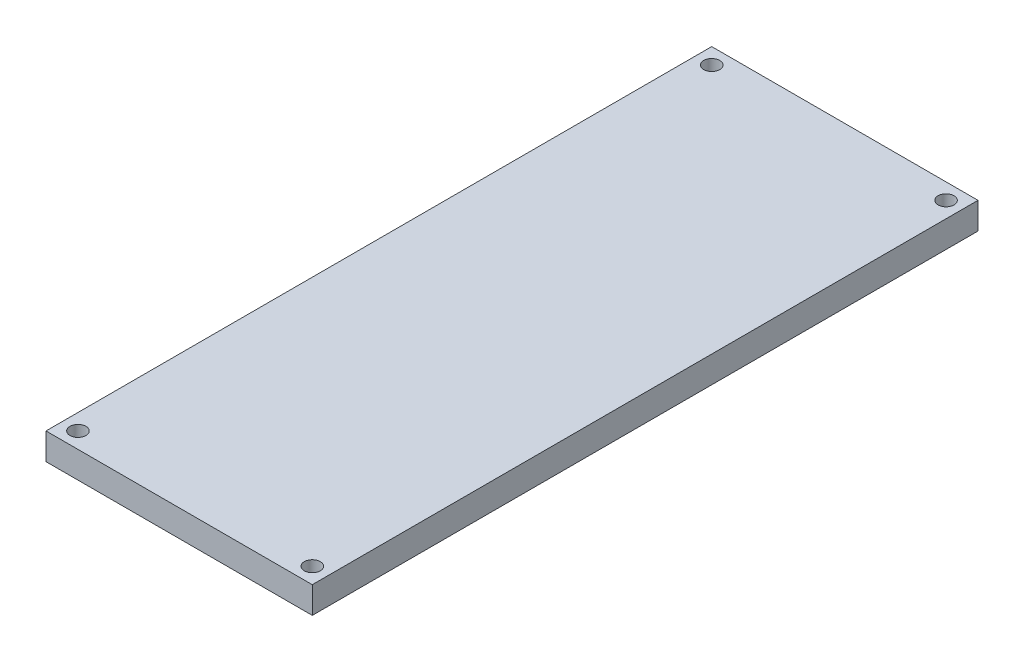
ISO-10303-21;
HEADER;
FILE_DESCRIPTION(('STEP AP214'),'2;1');
FILE_NAME('part.step','',(''),(''),'','','');
FILE_SCHEMA(('AUTOMOTIVE_DESIGN { 1 0 10303 214 1 1 1 1 }'));
ENDSEC;
DATA;
#1=APPLICATION_CONTEXT('core data for automotive mechanical design processes');
#2=APPLICATION_PROTOCOL_DEFINITION('international standard','automotive_design',2000,#1);
#3=PRODUCT_CONTEXT('',#1,'mechanical');
#4=PRODUCT('Part','Part','',(#3));
#5=PRODUCT_RELATED_PRODUCT_CATEGORY('part','',(#4));
#6=PRODUCT_DEFINITION_FORMATION('','',#4);
#7=PRODUCT_DEFINITION_CONTEXT('part definition',#1,'design');
#8=PRODUCT_DEFINITION('design','',#6,#7);
#9=PRODUCT_DEFINITION_SHAPE('','',#8);
#10=(LENGTH_UNIT() NAMED_UNIT(*) SI_UNIT(.MILLI.,.METRE.));
#11=(NAMED_UNIT(*) PLANE_ANGLE_UNIT() SI_UNIT($,.RADIAN.));
#12=(NAMED_UNIT(*) SI_UNIT($,.STERADIAN.) SOLID_ANGLE_UNIT());
#13=UNCERTAINTY_MEASURE_WITH_UNIT(LENGTH_MEASURE(1.E-05),#10,'distance_accuracy_value','');
#14=(GEOMETRIC_REPRESENTATION_CONTEXT(3) GLOBAL_UNCERTAINTY_ASSIGNED_CONTEXT((#13)) GLOBAL_UNIT_ASSIGNED_CONTEXT((#10,
#11,#12)) REPRESENTATION_CONTEXT('',''));
#15=CARTESIAN_POINT('',(0.,0.,0.));
#16=DIRECTION('',(0.,0.,1.));
#17=DIRECTION('',(1.,0.,0.));
#18=AXIS2_PLACEMENT_3D('',#15,#16,#17);
#19=CARTESIAN_POINT('',(0.,5.,0.));
#20=DIRECTION('',(1.,0.,0.));
#21=DIRECTION('',(0.,0.,-1.));
#22=AXIS2_PLACEMENT_3D('',#19,#20,#21);
#23=PLANE('',#22);
#24=DIRECTION('',(0.,0.,1.));
#25=VECTOR('',#24,1.);
#26=CARTESIAN_POINT('',(0.,0.,0.));
#27=LINE('',#26,#25);
#28=CARTESIAN_POINT('',(0.,0.,-125.));
#29=VERTEX_POINT('',#28);
#30=CARTESIAN_POINT('',(0.,0.,0.));
#31=VERTEX_POINT('',#30);
#32=EDGE_CURVE('E107',#29,#31,#27,.T.);
#33=ORIENTED_EDGE('',*,*,#32,.T.);
#34=DIRECTION('',(0.,-1.,0.));
#35=VECTOR('',#34,1.);
#36=CARTESIAN_POINT('',(0.,5.,0.));
#37=LINE('',#36,#35);
#38=CARTESIAN_POINT('',(0.,5.,0.));
#39=VERTEX_POINT('',#38);
#40=EDGE_CURVE('E11',#39,#31,#37,.T.);
#41=ORIENTED_EDGE('',*,*,#40,.F.);
#42=DIRECTION('',(0.,0.,1.));
#43=VECTOR('',#42,1.);
#44=CARTESIAN_POINT('',(0.,5.,0.));
#45=LINE('',#44,#43);
#46=CARTESIAN_POINT('',(0.,5.,-125.));
#47=VERTEX_POINT('',#46);
#48=EDGE_CURVE('E91',#47,#39,#45,.T.);
#49=ORIENTED_EDGE('',*,*,#48,.F.);
#50=DIRECTION('',(0.,-1.,0.));
#51=VECTOR('',#50,1.);
#52=CARTESIAN_POINT('',(0.,5.,-125.));
#53=LINE('',#52,#51);
#54=EDGE_CURVE('E103',#47,#29,#53,.T.);
#55=ORIENTED_EDGE('',*,*,#54,.T.);
#56=EDGE_LOOP('',(#33,#41,#49,#55));
#57=FACE_BOUND('',#56,.T.);
#58=ADVANCED_FACE('F39',(#57),#23,.F.);
#59=CARTESIAN_POINT('',(0.,5.,0.));
#60=DIRECTION('',(0.,0.,-1.));
#61=DIRECTION('',(-1.,0.,0.));
#62=AXIS2_PLACEMENT_3D('',#59,#60,#61);
#63=PLANE('',#62);
#64=DIRECTION('',(1.,0.,0.));
#65=VECTOR('',#64,1.);
#66=CARTESIAN_POINT('',(0.,0.,0.));
#67=LINE('',#66,#65);
#68=CARTESIAN_POINT('',(50.,0.,0.));
#69=VERTEX_POINT('',#68);
#70=EDGE_CURVE('E96',#31,#69,#67,.T.);
#71=ORIENTED_EDGE('',*,*,#70,.T.);
#72=DIRECTION('',(0.,-1.,0.));
#73=VECTOR('',#72,1.);
#74=CARTESIAN_POINT('',(50.,5.,0.));
#75=LINE('',#74,#73);
#76=CARTESIAN_POINT('',(50.,5.,0.));
#77=VERTEX_POINT('',#76);
#78=EDGE_CURVE('E48',#77,#69,#75,.T.);
#79=ORIENTED_EDGE('',*,*,#78,.F.);
#80=DIRECTION('',(1.,0.,0.));
#81=VECTOR('',#80,1.);
#82=CARTESIAN_POINT('',(0.,5.,0.));
#83=LINE('',#82,#81);
#84=EDGE_CURVE('E86',#39,#77,#83,.T.);
#85=ORIENTED_EDGE('',*,*,#84,.F.);
#86=ORIENTED_EDGE('',*,*,#40,.T.);
#87=EDGE_LOOP('',(#71,#79,#85,#86));
#88=FACE_BOUND('',#87,.T.);
#89=ADVANCED_FACE('F95',(#88),#63,.F.);
#90=CARTESIAN_POINT('',(50.,5.,0.));
#91=DIRECTION('',(-1.,0.,0.));
#92=DIRECTION('',(0.,0.,1.));
#93=AXIS2_PLACEMENT_3D('',#90,#91,#92);
#94=PLANE('',#93);
#95=DIRECTION('',(0.,0.,-1.));
#96=VECTOR('',#95,1.);
#97=CARTESIAN_POINT('',(50.,0.,0.));
#98=LINE('',#97,#96);
#99=CARTESIAN_POINT('',(50.,0.,-125.));
#100=VERTEX_POINT('',#99);
#101=EDGE_CURVE('E73',#69,#100,#98,.T.);
#102=ORIENTED_EDGE('',*,*,#101,.T.);
#103=DIRECTION('',(0.,-1.,0.));
#104=VECTOR('',#103,1.);
#105=CARTESIAN_POINT('',(50.,5.,-125.));
#106=LINE('',#105,#104);
#107=CARTESIAN_POINT('',(50.,5.,-125.));
#108=VERTEX_POINT('',#107);
#109=EDGE_CURVE('E98',#108,#100,#106,.T.);
#110=ORIENTED_EDGE('',*,*,#109,.F.);
#111=DIRECTION('',(0.,0.,-1.));
#112=VECTOR('',#111,1.);
#113=CARTESIAN_POINT('',(50.,5.,0.));
#114=LINE('',#113,#112);
#115=EDGE_CURVE('E89',#77,#108,#114,.T.);
#116=ORIENTED_EDGE('',*,*,#115,.F.);
#117=ORIENTED_EDGE('',*,*,#78,.T.);
#118=EDGE_LOOP('',(#102,#110,#116,#117));
#119=FACE_BOUND('',#118,.T.);
#120=ADVANCED_FACE('F99',(#119),#94,.F.);
#121=CARTESIAN_POINT('',(0.,5.,-125.));
#122=DIRECTION('',(0.,0.,1.));
#123=DIRECTION('',(1.,0.,0.));
#124=AXIS2_PLACEMENT_3D('',#121,#122,#123);
#125=PLANE('',#124);
#126=DIRECTION('',(-1.,0.,0.));
#127=VECTOR('',#126,1.);
#128=CARTESIAN_POINT('',(0.,0.,-125.));
#129=LINE('',#128,#127);
#130=EDGE_CURVE('E79',#100,#29,#129,.T.);
#131=ORIENTED_EDGE('',*,*,#130,.T.);
#132=ORIENTED_EDGE('',*,*,#54,.F.);
#133=DIRECTION('',(-1.,0.,0.));
#134=VECTOR('',#133,1.);
#135=CARTESIAN_POINT('',(0.,5.,-125.));
#136=LINE('',#135,#134);
#137=EDGE_CURVE('E56',#108,#47,#136,.T.);
#138=ORIENTED_EDGE('',*,*,#137,.F.);
#139=ORIENTED_EDGE('',*,*,#109,.T.);
#140=EDGE_LOOP('',(#131,#132,#138,#139));
#141=FACE_BOUND('',#140,.T.);
#142=ADVANCED_FACE('F121',(#141),#125,.F.);
#143=CARTESIAN_POINT('',(0.,5.,0.));
#144=DIRECTION('',(0.,-1.,0.));
#145=DIRECTION('',(0.,0.,-1.));
#146=AXIS2_PLACEMENT_3D('',#143,#144,#145);
#147=PLANE('',#146);
#148=CARTESIAN_POINT('',(47.,5.,-122.));
#149=DIRECTION('',(0.,1.,0.));
#150=DIRECTION('',(0.,0.,1.));
#151=AXIS2_PLACEMENT_3D('',#148,#149,#150);
#152=CIRCLE('',#151,1.5);
#153=CARTESIAN_POINT('',(47.,5.,-120.5));
#154=VERTEX_POINT('',#153);
#155=EDGE_CURVE('E145',#154,#154,#152,.T.);
#156=ORIENTED_EDGE('',*,*,#155,.F.);
#157=EDGE_LOOP('',(#156));
#158=FACE_BOUND('',#157,.T.);
#159=CARTESIAN_POINT('',(3.,5.,-3.));
#160=DIRECTION('',(0.,1.,0.));
#161=DIRECTION('',(0.,0.,1.));
#162=AXIS2_PLACEMENT_3D('',#159,#160,#161);
#163=CIRCLE('',#162,1.5);
#164=CARTESIAN_POINT('',(3.,5.,-1.5));
#165=VERTEX_POINT('',#164);
#166=EDGE_CURVE('E136',#165,#165,#163,.T.);
#167=ORIENTED_EDGE('',*,*,#166,.F.);
#168=EDGE_LOOP('',(#167));
#169=FACE_BOUND('',#168,.T.);
#170=CARTESIAN_POINT('',(47.,5.,-3.));
#171=DIRECTION('',(0.,1.,0.));
#172=DIRECTION('',(0.,0.,1.));
#173=AXIS2_PLACEMENT_3D('',#170,#171,#172);
#174=CIRCLE('',#173,1.5);
#175=CARTESIAN_POINT('',(47.,5.,-1.5));
#176=VERTEX_POINT('',#175);
#177=EDGE_CURVE('E152',#176,#176,#174,.T.);
#178=ORIENTED_EDGE('',*,*,#177,.F.);
#179=EDGE_LOOP('',(#178));
#180=FACE_BOUND('',#179,.T.);
#181=CARTESIAN_POINT('',(3.,5.,-122.));
#182=DIRECTION('',(0.,1.,0.));
#183=DIRECTION('',(0.,0.,1.));
#184=AXIS2_PLACEMENT_3D('',#181,#182,#183);
#185=CIRCLE('',#184,1.5);
#186=CARTESIAN_POINT('',(3.,5.,-120.5));
#187=VERTEX_POINT('',#186);
#188=EDGE_CURVE('E128',#187,#187,#185,.T.);
#189=ORIENTED_EDGE('',*,*,#188,.F.);
#190=EDGE_LOOP('',(#189));
#191=FACE_BOUND('',#190,.T.);
#192=ORIENTED_EDGE('',*,*,#48,.T.);
#193=ORIENTED_EDGE('',*,*,#84,.T.);
#194=ORIENTED_EDGE('',*,*,#115,.T.);
#195=ORIENTED_EDGE('',*,*,#137,.T.);
#196=EDGE_LOOP('',(#192,#193,#194,#195));
#197=FACE_BOUND('',#196,.T.);
#198=ADVANCED_FACE('F87',(#158,#169,#180,#191,#197),#147,.F.);
#199=CARTESIAN_POINT('',(0.,0.,0.));
#200=DIRECTION('',(0.,-1.,0.));
#201=DIRECTION('',(0.,0.,-1.));
#202=AXIS2_PLACEMENT_3D('',#199,#200,#201);
#203=PLANE('',#202);
#204=CARTESIAN_POINT('',(47.,0.,-122.));
#205=DIRECTION('',(0.,1.,0.));
#206=DIRECTION('',(0.,0.,1.));
#207=AXIS2_PLACEMENT_3D('',#204,#205,#206);
#208=CIRCLE('',#207,1.5);
#209=CARTESIAN_POINT('',(47.,0.,-120.5));
#210=VERTEX_POINT('',#209);
#211=EDGE_CURVE('E132',#210,#210,#208,.T.);
#212=ORIENTED_EDGE('',*,*,#211,.T.);
#213=EDGE_LOOP('',(#212));
#214=FACE_BOUND('',#213,.T.);
#215=CARTESIAN_POINT('',(3.,0.,-3.));
#216=DIRECTION('',(0.,1.,0.));
#217=DIRECTION('',(0.,0.,1.));
#218=AXIS2_PLACEMENT_3D('',#215,#216,#217);
#219=CIRCLE('',#218,1.5);
#220=CARTESIAN_POINT('',(3.,0.,-1.5));
#221=VERTEX_POINT('',#220);
#222=EDGE_CURVE('E140',#221,#221,#219,.T.);
#223=ORIENTED_EDGE('',*,*,#222,.T.);
#224=EDGE_LOOP('',(#223));
#225=FACE_BOUND('',#224,.T.);
#226=CARTESIAN_POINT('',(47.,0.,-3.));
#227=DIRECTION('',(0.,1.,0.));
#228=DIRECTION('',(0.,0.,1.));
#229=AXIS2_PLACEMENT_3D('',#226,#227,#228);
#230=CIRCLE('',#229,1.5);
#231=CARTESIAN_POINT('',(47.,0.,-1.5));
#232=VERTEX_POINT('',#231);
#233=EDGE_CURVE('E141',#232,#232,#230,.T.);
#234=ORIENTED_EDGE('',*,*,#233,.T.);
#235=EDGE_LOOP('',(#234));
#236=FACE_BOUND('',#235,.T.);
#237=CARTESIAN_POINT('',(3.,0.,-122.));
#238=DIRECTION('',(0.,1.,0.));
#239=DIRECTION('',(0.,0.,1.));
#240=AXIS2_PLACEMENT_3D('',#237,#238,#239);
#241=CIRCLE('',#240,1.5);
#242=CARTESIAN_POINT('',(3.,0.,-120.5));
#243=VERTEX_POINT('',#242);
#244=EDGE_CURVE('E111',#243,#243,#241,.T.);
#245=ORIENTED_EDGE('',*,*,#244,.T.);
#246=EDGE_LOOP('',(#245));
#247=FACE_BOUND('',#246,.T.);
#248=ORIENTED_EDGE('',*,*,#32,.F.);
#249=ORIENTED_EDGE('',*,*,#130,.F.);
#250=ORIENTED_EDGE('',*,*,#101,.F.);
#251=ORIENTED_EDGE('',*,*,#70,.F.);
#252=EDGE_LOOP('',(#248,#249,#250,#251));
#253=FACE_BOUND('',#252,.T.);
#254=ADVANCED_FACE('F124',(#214,#225,#236,#247,#253),#203,.T.);
#255=CARTESIAN_POINT('',(3.,0.,-122.));
#256=DIRECTION('',(0.,1.,0.));
#257=DIRECTION('',(0.,0.,1.));
#258=AXIS2_PLACEMENT_3D('',#255,#256,#257);
#259=CYLINDRICAL_SURFACE('',#258,1.5);
#260=ORIENTED_EDGE('',*,*,#244,.F.);
#261=EDGE_LOOP('',(#260));
#262=FACE_BOUND('',#261,.T.);
#263=ORIENTED_EDGE('',*,*,#188,.T.);
#264=EDGE_LOOP('',(#263));
#265=FACE_BOUND('',#264,.T.);
#266=ADVANCED_FACE('F166',(#262,#265),#259,.F.);
#267=CARTESIAN_POINT('',(47.,0.,-3.));
#268=DIRECTION('',(0.,1.,0.));
#269=DIRECTION('',(0.,0.,1.));
#270=AXIS2_PLACEMENT_3D('',#267,#268,#269);
#271=CYLINDRICAL_SURFACE('',#270,1.5);
#272=ORIENTED_EDGE('',*,*,#233,.F.);
#273=EDGE_LOOP('',(#272));
#274=FACE_BOUND('',#273,.T.);
#275=ORIENTED_EDGE('',*,*,#177,.T.);
#276=EDGE_LOOP('',(#275));
#277=FACE_BOUND('',#276,.T.);
#278=ADVANCED_FACE('F162',(#274,#277),#271,.F.);
#279=CARTESIAN_POINT('',(3.,0.,-3.));
#280=DIRECTION('',(0.,1.,0.));
#281=DIRECTION('',(0.,0.,1.));
#282=AXIS2_PLACEMENT_3D('',#279,#280,#281);
#283=CYLINDRICAL_SURFACE('',#282,1.5);
#284=ORIENTED_EDGE('',*,*,#222,.F.);
#285=EDGE_LOOP('',(#284));
#286=FACE_BOUND('',#285,.T.);
#287=ORIENTED_EDGE('',*,*,#166,.T.);
#288=EDGE_LOOP('',(#287));
#289=FACE_BOUND('',#288,.T.);
#290=ADVANCED_FACE('F165',(#286,#289),#283,.F.);
#291=CARTESIAN_POINT('',(47.,0.,-122.));
#292=DIRECTION('',(0.,1.,0.));
#293=DIRECTION('',(0.,0.,1.));
#294=AXIS2_PLACEMENT_3D('',#291,#292,#293);
#295=CYLINDRICAL_SURFACE('',#294,1.5);
#296=ORIENTED_EDGE('',*,*,#211,.F.);
#297=EDGE_LOOP('',(#296));
#298=FACE_BOUND('',#297,.T.);
#299=ORIENTED_EDGE('',*,*,#155,.T.);
#300=EDGE_LOOP('',(#299));
#301=FACE_BOUND('',#300,.T.);
#302=ADVANCED_FACE('F227',(#298,#301),#295,.F.);
#303=CLOSED_SHELL('',(#58,#89,#120,#142,#198,#254,#266,#278,#290,#302));
#304=MANIFOLD_SOLID_BREP('B2',#303);
#305=ADVANCED_BREP_SHAPE_REPRESENTATION('',(#18,#304),#14);
#306=SHAPE_DEFINITION_REPRESENTATION(#9,#305);
ENDSEC;
END-ISO-10303-21;
